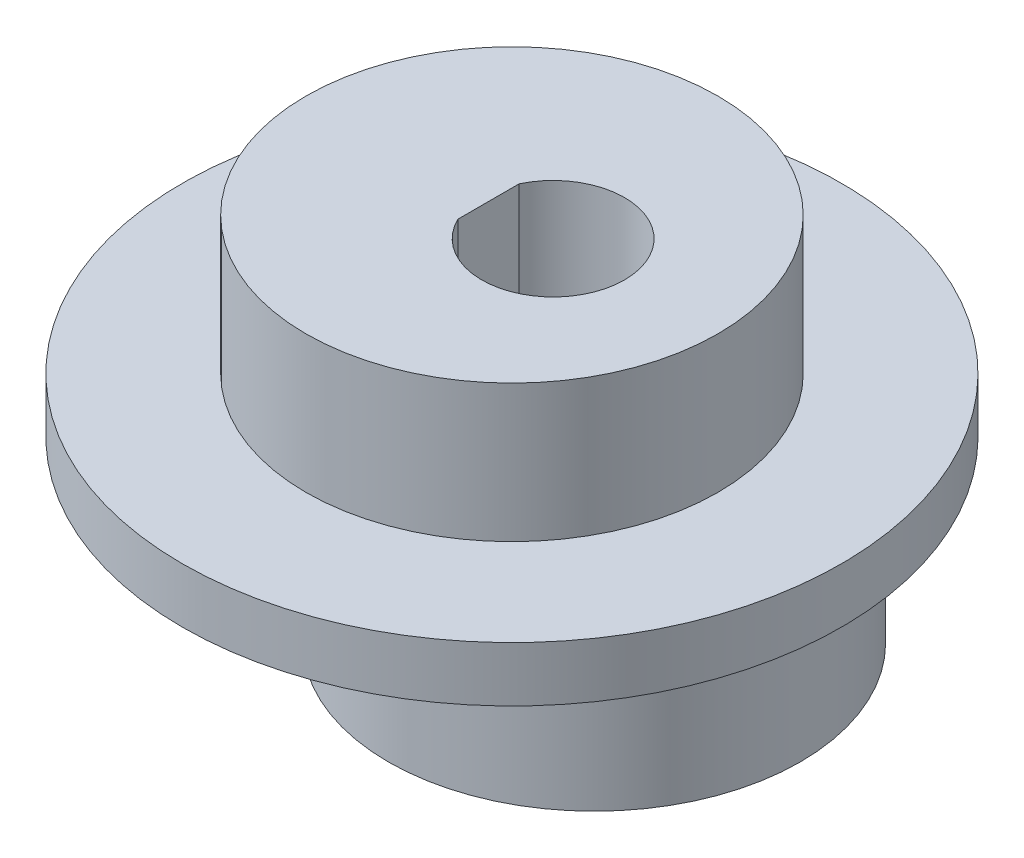
ISO-10303-21;
HEADER;
FILE_DESCRIPTION(('STEP AP214'),'2;1');
FILE_NAME('part.step','',(''),(''),'','','');
FILE_SCHEMA(('AUTOMOTIVE_DESIGN { 1 0 10303 214 1 1 1 1 }'));
ENDSEC;
DATA;
#1=APPLICATION_CONTEXT('core data for automotive mechanical design processes');
#2=APPLICATION_PROTOCOL_DEFINITION('international standard','automotive_design',2000,#1);
#3=PRODUCT_CONTEXT('',#1,'mechanical');
#4=PRODUCT('Part','Part','',(#3));
#5=PRODUCT_RELATED_PRODUCT_CATEGORY('part','',(#4));
#6=PRODUCT_DEFINITION_FORMATION('','',#4);
#7=PRODUCT_DEFINITION_CONTEXT('part definition',#1,'design');
#8=PRODUCT_DEFINITION('design','',#6,#7);
#9=PRODUCT_DEFINITION_SHAPE('','',#8);
#10=(LENGTH_UNIT() NAMED_UNIT(*) SI_UNIT(.MILLI.,.METRE.));
#11=(NAMED_UNIT(*) PLANE_ANGLE_UNIT() SI_UNIT($,.RADIAN.));
#12=(NAMED_UNIT(*) SI_UNIT($,.STERADIAN.) SOLID_ANGLE_UNIT());
#13=UNCERTAINTY_MEASURE_WITH_UNIT(LENGTH_MEASURE(1.E-05),#10,'distance_accuracy_value','');
#14=(GEOMETRIC_REPRESENTATION_CONTEXT(3) GLOBAL_UNCERTAINTY_ASSIGNED_CONTEXT((#13)) GLOBAL_UNIT_ASSIGNED_CONTEXT((#10,
#11,#12)) REPRESENTATION_CONTEXT('',''));
#15=CARTESIAN_POINT('',(0.,0.,0.));
#16=DIRECTION('',(0.,0.,1.));
#17=DIRECTION('',(1.,0.,0.));
#18=AXIS2_PLACEMENT_3D('',#15,#16,#17);
#19=CARTESIAN_POINT('',(0.,5.,0.));
#20=DIRECTION('',(0.,-1.,0.));
#21=DIRECTION('',(0.,0.,-1.));
#22=AXIS2_PLACEMENT_3D('',#19,#20,#21);
#23=CYLINDRICAL_SURFACE('',#22,7.5);
#24=CARTESIAN_POINT('',(0.,0.,0.));
#25=DIRECTION('',(0.,1.,0.));
#26=DIRECTION('',(0.,0.,1.));
#27=AXIS2_PLACEMENT_3D('',#24,#25,#26);
#28=CIRCLE('',#27,7.5);
#29=CARTESIAN_POINT('',(0.,0.,7.5));
#30=VERTEX_POINT('',#29);
#31=EDGE_CURVE('E90',#30,#30,#28,.T.);
#32=ORIENTED_EDGE('',*,*,#31,.T.);
#33=EDGE_LOOP('',(#32));
#34=FACE_BOUND('',#33,.T.);
#35=CARTESIAN_POINT('',(0.,5.,0.));
#36=DIRECTION('',(0.,1.,0.));
#37=DIRECTION('',(0.,0.,1.));
#38=AXIS2_PLACEMENT_3D('',#35,#36,#37);
#39=CIRCLE('',#38,7.5);
#40=CARTESIAN_POINT('',(0.,5.,7.5));
#41=VERTEX_POINT('',#40);
#42=EDGE_CURVE('E45',#41,#41,#39,.T.);
#43=ORIENTED_EDGE('',*,*,#42,.F.);
#44=EDGE_LOOP('',(#43));
#45=FACE_BOUND('',#44,.T.);
#46=ADVANCED_FACE('F42',(#34,#45),#23,.T.);
#47=CARTESIAN_POINT('',(0.,5.,0.));
#48=DIRECTION('',(0.,1.,0.));
#49=DIRECTION('',(0.,0.,1.));
#50=AXIS2_PLACEMENT_3D('',#47,#48,#49);
#51=PLANE('',#50);
#52=CARTESIAN_POINT('',(1.5,5.,0.));
#53=DIRECTION('',(0.,1.,0.));
#54=DIRECTION('',(0.,0.,1.));
#55=AXIS2_PLACEMENT_3D('',#52,#53,#54);
#56=CIRCLE('',#55,2.6);
#57=CARTESIAN_POINT('',(-0.85,5.,1.11242977306435));
#58=VERTEX_POINT('',#57);
#59=CARTESIAN_POINT('',(-0.85,5.,-1.11242977306435));
#60=VERTEX_POINT('',#59);
#61=EDGE_CURVE('E57',#58,#60,#56,.T.);
#62=ORIENTED_EDGE('',*,*,#61,.F.);
#63=DIRECTION('',(0.,0.,-1.));
#64=VECTOR('',#63,1.);
#65=CARTESIAN_POINT('',(-0.85,5.,1.11242977306435));
#66=LINE('',#65,#64);
#67=EDGE_CURVE('E77',#58,#60,#66,.T.);
#68=ORIENTED_EDGE('',*,*,#67,.T.);
#69=EDGE_LOOP('',(#62,#68));
#70=FACE_BOUND('',#69,.T.);
#71=ORIENTED_EDGE('',*,*,#42,.T.);
#72=EDGE_LOOP('',(#71));
#73=FACE_BOUND('',#72,.T.);
#74=ADVANCED_FACE('F81',(#70,#73),#51,.T.);
#75=CARTESIAN_POINT('',(0.,-2.,0.));
#76=DIRECTION('',(0.,1.,0.));
#77=DIRECTION('',(0.,0.,1.));
#78=AXIS2_PLACEMENT_3D('',#75,#76,#77);
#79=CYLINDRICAL_SURFACE('',#78,12.);
#80=CARTESIAN_POINT('',(0.,-2.,0.));
#81=DIRECTION('',(0.,1.,0.));
#82=DIRECTION('',(0.,0.,1.));
#83=AXIS2_PLACEMENT_3D('',#80,#81,#82);
#84=CIRCLE('',#83,12.);
#85=CARTESIAN_POINT('',(0.,-2.,12.));
#86=VERTEX_POINT('',#85);
#87=EDGE_CURVE('E92',#86,#86,#84,.T.);
#88=ORIENTED_EDGE('',*,*,#87,.T.);
#89=EDGE_LOOP('',(#88));
#90=FACE_BOUND('',#89,.T.);
#91=CARTESIAN_POINT('',(0.,0.,0.));
#92=DIRECTION('',(0.,1.,0.));
#93=DIRECTION('',(0.,0.,1.));
#94=AXIS2_PLACEMENT_3D('',#91,#92,#93);
#95=CIRCLE('',#94,12.);
#96=CARTESIAN_POINT('',(0.,0.,12.));
#97=VERTEX_POINT('',#96);
#98=EDGE_CURVE('E95',#97,#97,#95,.T.);
#99=ORIENTED_EDGE('',*,*,#98,.F.);
#100=EDGE_LOOP('',(#99));
#101=FACE_BOUND('',#100,.T.);
#102=ADVANCED_FACE('F102',(#90,#101),#79,.T.);
#103=CARTESIAN_POINT('',(0.,0.,0.));
#104=DIRECTION('',(0.,1.,0.));
#105=DIRECTION('',(0.,0.,1.));
#106=AXIS2_PLACEMENT_3D('',#103,#104,#105);
#107=PLANE('',#106);
#108=ORIENTED_EDGE('',*,*,#31,.F.);
#109=EDGE_LOOP('',(#108));
#110=FACE_BOUND('',#109,.T.);
#111=ORIENTED_EDGE('',*,*,#98,.T.);
#112=EDGE_LOOP('',(#111));
#113=FACE_BOUND('',#112,.T.);
#114=ADVANCED_FACE('F100',(#110,#113),#107,.T.);
#115=CARTESIAN_POINT('',(0.,-2.,0.));
#116=DIRECTION('',(0.,1.,0.));
#117=DIRECTION('',(0.,0.,1.));
#118=AXIS2_PLACEMENT_3D('',#115,#116,#117);
#119=PLANE('',#118);
#120=CARTESIAN_POINT('',(3.,-2.,0.));
#121=DIRECTION('',(0.,-1.,0.));
#122=DIRECTION('',(0.,0.,-1.));
#123=AXIS2_PLACEMENT_3D('',#120,#121,#122);
#124=CIRCLE('',#123,7.5);
#125=CARTESIAN_POINT('',(3.,-2.,-7.5));
#126=VERTEX_POINT('',#125);
#127=EDGE_CURVE('E11',#126,#126,#124,.T.);
#128=ORIENTED_EDGE('',*,*,#127,.F.);
#129=EDGE_LOOP('',(#128));
#130=FACE_BOUND('',#129,.T.);
#131=ORIENTED_EDGE('',*,*,#87,.F.);
#132=EDGE_LOOP('',(#131));
#133=FACE_BOUND('',#132,.T.);
#134=ADVANCED_FACE('F110',(#130,#133),#119,.F.);
#135=CARTESIAN_POINT('',(3.,-7.,0.));
#136=DIRECTION('',(0.,1.,0.));
#137=DIRECTION('',(0.,0.,1.));
#138=AXIS2_PLACEMENT_3D('',#135,#136,#137);
#139=CYLINDRICAL_SURFACE('',#138,7.5);
#140=CARTESIAN_POINT('',(3.,-7.,0.));
#141=DIRECTION('',(0.,-1.,0.));
#142=DIRECTION('',(0.,0.,-1.));
#143=AXIS2_PLACEMENT_3D('',#140,#141,#142);
#144=CIRCLE('',#143,7.5);
#145=CARTESIAN_POINT('',(3.,-7.,-7.5));
#146=VERTEX_POINT('',#145);
#147=EDGE_CURVE('E73',#146,#146,#144,.T.);
#148=ORIENTED_EDGE('',*,*,#147,.F.);
#149=EDGE_LOOP('',(#148));
#150=FACE_BOUND('',#149,.T.);
#151=ORIENTED_EDGE('',*,*,#127,.T.);
#152=EDGE_LOOP('',(#151));
#153=FACE_BOUND('',#152,.T.);
#154=ADVANCED_FACE('F135',(#150,#153),#139,.T.);
#155=CARTESIAN_POINT('',(3.,-7.,0.));
#156=DIRECTION('',(0.,-1.,0.));
#157=DIRECTION('',(0.,0.,-1.));
#158=AXIS2_PLACEMENT_3D('',#155,#156,#157);
#159=PLANE('',#158);
#160=CARTESIAN_POINT('',(1.5,-7.,0.));
#161=DIRECTION('',(0.,1.,0.));
#162=DIRECTION('',(0.,0.,1.));
#163=AXIS2_PLACEMENT_3D('',#160,#161,#162);
#164=CIRCLE('',#163,2.6);
#165=CARTESIAN_POINT('',(-0.85,-7.,1.11242977306435));
#166=VERTEX_POINT('',#165);
#167=CARTESIAN_POINT('',(-0.85,-7.,-1.11242977306435));
#168=VERTEX_POINT('',#167);
#169=EDGE_CURVE('E62',#166,#168,#164,.T.);
#170=ORIENTED_EDGE('',*,*,#169,.T.);
#171=DIRECTION('',(0.,0.,-1.));
#172=VECTOR('',#171,1.);
#173=CARTESIAN_POINT('',(-0.85,-7.,1.11242977306435));
#174=LINE('',#173,#172);
#175=EDGE_CURVE('E85',#166,#168,#174,.T.);
#176=ORIENTED_EDGE('',*,*,#175,.F.);
#177=EDGE_LOOP('',(#170,#176));
#178=FACE_BOUND('',#177,.T.);
#179=ORIENTED_EDGE('',*,*,#147,.T.);
#180=EDGE_LOOP('',(#179));
#181=FACE_BOUND('',#180,.T.);
#182=ADVANCED_FACE('F140',(#178,#181),#159,.T.);
#183=CARTESIAN_POINT('',(1.5,-7.,0.));
#184=DIRECTION('',(0.,1.,0.));
#185=DIRECTION('',(0.,0.,1.));
#186=AXIS2_PLACEMENT_3D('',#183,#184,#185);
#187=CYLINDRICAL_SURFACE('',#186,2.6);
#188=ORIENTED_EDGE('',*,*,#61,.T.);
#189=DIRECTION('',(0.,1.,0.));
#190=VECTOR('',#189,1.);
#191=CARTESIAN_POINT('',(-0.85,-7.,-1.11242977306435));
#192=LINE('',#191,#190);
#193=EDGE_CURVE('E74',#168,#60,#192,.T.);
#194=ORIENTED_EDGE('',*,*,#193,.F.);
#195=ORIENTED_EDGE('',*,*,#169,.F.);
#196=DIRECTION('',(0.,1.,0.));
#197=VECTOR('',#196,1.);
#198=CARTESIAN_POINT('',(-0.85,-7.,1.11242977306435));
#199=LINE('',#198,#197);
#200=EDGE_CURVE('E68',#166,#58,#199,.T.);
#201=ORIENTED_EDGE('',*,*,#200,.T.);
#202=EDGE_LOOP('',(#188,#194,#195,#201));
#203=FACE_BOUND('',#202,.T.);
#204=ADVANCED_FACE('F70',(#203),#187,.F.);
#205=CARTESIAN_POINT('',(-0.85,-7.,1.11242977306435));
#206=DIRECTION('',(1.,0.,0.));
#207=DIRECTION('',(0.,0.,-1.));
#208=AXIS2_PLACEMENT_3D('',#205,#206,#207);
#209=PLANE('',#208);
#210=ORIENTED_EDGE('',*,*,#67,.F.);
#211=ORIENTED_EDGE('',*,*,#200,.F.);
#212=ORIENTED_EDGE('',*,*,#175,.T.);
#213=ORIENTED_EDGE('',*,*,#193,.T.);
#214=EDGE_LOOP('',(#210,#211,#212,#213));
#215=FACE_BOUND('',#214,.T.);
#216=ADVANCED_FACE('F78',(#215),#209,.T.);
#217=CLOSED_SHELL('',(#46,#74,#102,#114,#134,#154,#182,#204,#216));
#218=MANIFOLD_SOLID_BREP('B2',#217);
#219=ADVANCED_BREP_SHAPE_REPRESENTATION('',(#18,#218),#14);
#220=SHAPE_DEFINITION_REPRESENTATION(#9,#219);
ENDSEC;
END-ISO-10303-21;
